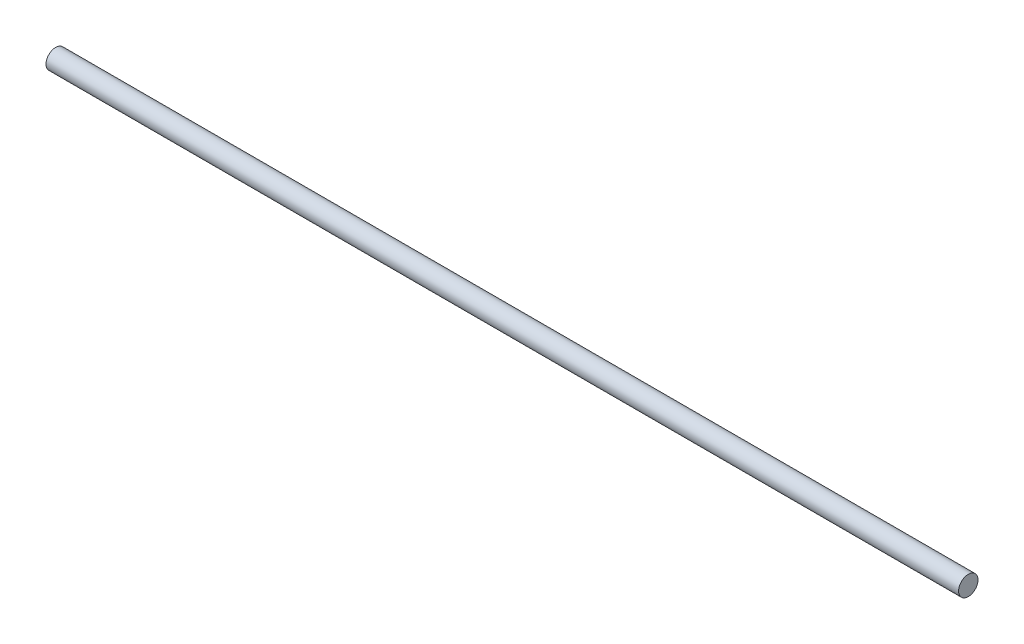
ISO-10303-21;
HEADER;
FILE_DESCRIPTION(('STEP AP214'),'2;1');
FILE_NAME('part.step','',(''),(''),'','','');
FILE_SCHEMA(('AUTOMOTIVE_DESIGN { 1 0 10303 214 1 1 1 1 }'));
ENDSEC;
DATA;
#1=APPLICATION_CONTEXT('core data for automotive mechanical design processes');
#2=APPLICATION_PROTOCOL_DEFINITION('international standard','automotive_design',2000,#1);
#3=PRODUCT_CONTEXT('',#1,'mechanical');
#4=PRODUCT('Part','Part','',(#3));
#5=PRODUCT_RELATED_PRODUCT_CATEGORY('part','',(#4));
#6=PRODUCT_DEFINITION_FORMATION('','',#4);
#7=PRODUCT_DEFINITION_CONTEXT('part definition',#1,'design');
#8=PRODUCT_DEFINITION('design','',#6,#7);
#9=PRODUCT_DEFINITION_SHAPE('','',#8);
#10=(LENGTH_UNIT() NAMED_UNIT(*) SI_UNIT(.MILLI.,.METRE.));
#11=(NAMED_UNIT(*) PLANE_ANGLE_UNIT() SI_UNIT($,.RADIAN.));
#12=(NAMED_UNIT(*) SI_UNIT($,.STERADIAN.) SOLID_ANGLE_UNIT());
#13=UNCERTAINTY_MEASURE_WITH_UNIT(LENGTH_MEASURE(1.E-05),#10,'distance_accuracy_value','');
#14=(GEOMETRIC_REPRESENTATION_CONTEXT(3) GLOBAL_UNCERTAINTY_ASSIGNED_CONTEXT((#13)) GLOBAL_UNIT_ASSIGNED_CONTEXT((#10,
#11,#12)) REPRESENTATION_CONTEXT('',''));
#15=CARTESIAN_POINT('',(0.,0.,0.));
#16=DIRECTION('',(0.,0.,1.));
#17=DIRECTION('',(1.,0.,0.));
#18=AXIS2_PLACEMENT_3D('',#15,#16,#17);
#19=CARTESIAN_POINT('',(1880.,-82.43469283425,1405.79287706017));
#20=DIRECTION('',(-1.,0.,0.));
#21=DIRECTION('',(0.,0.,1.));
#22=AXIS2_PLACEMENT_3D('',#19,#20,#21);
#23=CYLINDRICAL_SURFACE('',#22,20.);
#24=CARTESIAN_POINT('',(1880.,-82.43469283425,1405.79287706017));
#25=DIRECTION('',(1.,0.,0.));
#26=DIRECTION('',(0.,0.,-1.));
#27=AXIS2_PLACEMENT_3D('',#24,#25,#26);
#28=CIRCLE('',#27,20.);
#29=CARTESIAN_POINT('',(1880.,-82.43469283425,1425.79287706017));
#30=VERTEX_POINT('',#29);
#31=EDGE_CURVE('E10',#30,#30,#28,.T.);
#32=CARTESIAN_POINT('',(0.,-82.43469283425,1405.79287706017));
#33=DIRECTION('',(1.,0.,0.));
#34=DIRECTION('',(0.,0.,-1.));
#35=AXIS2_PLACEMENT_3D('',#32,#33,#34);
#36=CIRCLE('',#35,20.);
#37=CARTESIAN_POINT('',(-2.22044604925031E-13,-82.43469283425,1425.79287706017));
#38=VERTEX_POINT('',#37);
#39=EDGE_CURVE('E40',#38,#38,#36,.T.);
#40=CARTESIAN_POINT('',(1880.,-82.43469283425,1425.79287706017));
#41=CARTESIAN_POINT('',(1860.41666666667,-82.43469283425,1425.79287706017));
#42=CARTESIAN_POINT('',(1840.83333333333,-82.43469283425,1425.79287706017));
#43=CARTESIAN_POINT('',(1801.66666666667,-82.43469283425,1425.79287706017));
#44=CARTESIAN_POINT('',(1782.08333333333,-82.43469283425,1425.79287706017));
#45=CARTESIAN_POINT('',(1742.91666666667,-82.43469283425,1425.79287706017));
#46=CARTESIAN_POINT('',(1723.33333333333,-82.43469283425,1425.79287706017));
#47=CARTESIAN_POINT('',(1684.16666666667,-82.43469283425,1425.79287706017));
#48=CARTESIAN_POINT('',(1664.58333333333,-82.43469283425,1425.79287706017));
#49=CARTESIAN_POINT('',(1625.41666666667,-82.43469283425,1425.79287706017));
#50=CARTESIAN_POINT('',(1605.83333333333,-82.43469283425,1425.79287706017));
#51=CARTESIAN_POINT('',(1566.66666666667,-82.43469283425,1425.79287706017));
#52=CARTESIAN_POINT('',(1547.08333333333,-82.43469283425,1425.79287706017));
#53=CARTESIAN_POINT('',(1507.91666666667,-82.43469283425,1425.79287706017));
#54=CARTESIAN_POINT('',(1488.33333333333,-82.43469283425,1425.79287706017));
#55=CARTESIAN_POINT('',(1449.16666666667,-82.43469283425,1425.79287706017));
#56=CARTESIAN_POINT('',(1429.58333333333,-82.43469283425,1425.79287706017));
#57=CARTESIAN_POINT('',(1390.41666666667,-82.43469283425,1425.79287706017));
#58=CARTESIAN_POINT('',(1370.83333333333,-82.43469283425,1425.79287706017));
#59=CARTESIAN_POINT('',(1331.66666666667,-82.43469283425,1425.79287706017));
#60=CARTESIAN_POINT('',(1312.08333333333,-82.43469283425,1425.79287706017));
#61=CARTESIAN_POINT('',(1272.91666666667,-82.43469283425,1425.79287706017));
#62=CARTESIAN_POINT('',(1253.33333333333,-82.43469283425,1425.79287706017));
#63=CARTESIAN_POINT('',(1214.16666666667,-82.43469283425,1425.79287706017));
#64=CARTESIAN_POINT('',(1194.58333333333,-82.43469283425,1425.79287706017));
#65=CARTESIAN_POINT('',(1155.41666666667,-82.43469283425,1425.79287706017));
#66=CARTESIAN_POINT('',(1135.83333333333,-82.43469283425,1425.79287706017));
#67=CARTESIAN_POINT('',(1096.66666666667,-82.43469283425,1425.79287706017));
#68=CARTESIAN_POINT('',(1077.08333333333,-82.43469283425,1425.79287706017));
#69=CARTESIAN_POINT('',(1037.91666666667,-82.43469283425,1425.79287706017));
#70=CARTESIAN_POINT('',(1018.33333333333,-82.43469283425,1425.79287706017));
#71=CARTESIAN_POINT('',(979.166666666666,-82.43469283425,1425.79287706017));
#72=CARTESIAN_POINT('',(959.583333333333,-82.43469283425,1425.79287706017));
#73=CARTESIAN_POINT('',(920.416666666666,-82.43469283425,1425.79287706017));
#74=CARTESIAN_POINT('',(900.833333333333,-82.43469283425,1425.79287706017));
#75=CARTESIAN_POINT('',(861.666666666667,-82.43469283425,1425.79287706017));
#76=CARTESIAN_POINT('',(842.083333333333,-82.43469283425,1425.79287706017));
#77=CARTESIAN_POINT('',(802.916666666667,-82.43469283425,1425.79287706017));
#78=CARTESIAN_POINT('',(783.333333333333,-82.43469283425,1425.79287706017));
#79=CARTESIAN_POINT('',(744.166666666667,-82.43469283425,1425.79287706017));
#80=CARTESIAN_POINT('',(724.583333333333,-82.43469283425,1425.79287706017));
#81=CARTESIAN_POINT('',(685.416666666667,-82.43469283425,1425.79287706017));
#82=CARTESIAN_POINT('',(665.833333333333,-82.43469283425,1425.79287706017));
#83=CARTESIAN_POINT('',(626.666666666667,-82.43469283425,1425.79287706017));
#84=CARTESIAN_POINT('',(607.083333333333,-82.43469283425,1425.79287706017));
#85=CARTESIAN_POINT('',(567.916666666667,-82.43469283425,1425.79287706017));
#86=CARTESIAN_POINT('',(548.333333333333,-82.43469283425,1425.79287706017));
#87=CARTESIAN_POINT('',(509.166666666667,-82.43469283425,1425.79287706017));
#88=CARTESIAN_POINT('',(489.583333333333,-82.43469283425,1425.79287706017));
#89=CARTESIAN_POINT('',(450.416666666667,-82.43469283425,1425.79287706017));
#90=CARTESIAN_POINT('',(430.833333333333,-82.43469283425,1425.79287706017));
#91=CARTESIAN_POINT('',(391.666666666667,-82.43469283425,1425.79287706017));
#92=CARTESIAN_POINT('',(372.083333333333,-82.43469283425,1425.79287706017));
#93=CARTESIAN_POINT('',(332.916666666666,-82.43469283425,1425.79287706017));
#94=CARTESIAN_POINT('',(313.333333333333,-82.43469283425,1425.79287706017));
#95=CARTESIAN_POINT('',(274.166666666666,-82.43469283425,1425.79287706017));
#96=CARTESIAN_POINT('',(254.583333333333,-82.43469283425,1425.79287706017));
#97=CARTESIAN_POINT('',(215.416666666667,-82.43469283425,1425.79287706017));
#98=CARTESIAN_POINT('',(195.833333333333,-82.43469283425,1425.79287706017));
#99=CARTESIAN_POINT('',(156.666666666666,-82.43469283425,1425.79287706017));
#100=CARTESIAN_POINT('',(137.083333333333,-82.43469283425,1425.79287706017));
#101=CARTESIAN_POINT('',(97.9166666666664,-82.43469283425,1425.79287706017));
#102=CARTESIAN_POINT('',(78.3333333333331,-82.43469283425,1425.79287706017));
#103=CARTESIAN_POINT('',(39.1666666666665,-82.43469283425,1425.79287706017));
#104=CARTESIAN_POINT('',(19.5833333333331,-82.43469283425,1425.79287706017));
#105=CARTESIAN_POINT('',(-2.22044604925031E-13,-82.43469283425,1425.79287706017));
#106=B_SPLINE_CURVE_WITH_KNOTS('',3,(#40,#41,#42,#43,#44,#45,#46,#47,#48,#49,#50,#51,#52,#53,
#54,#55,#56,#57,#58,#59,#60,#61,#62,#63,#64,#65,#66,#67,#68,#69,#70,#71,#72,#73,#74,#75,#76,#77,
#78,#79,#80,#81,#82,#83,#84,#85,#86,#87,#88,#89,#90,#91,#92,#93,#94,#95,#96,#97,#98,#99,#100,
#101,#102,#103,#104,#105),.UNSPECIFIED.,.F.,.F.,(4,2,2,2,2,2,2,2,2,2,2,2,2,2,2,2,2,2,2,2,2,2,2,
2,2,2,2,2,2,2,2,2,4),(0.,58.7500000000001,117.5,176.25,235.,293.75,352.5,411.25,470.,528.75,
587.5,646.25,705.,763.75,822.5,881.25,940.,998.75,1057.5,1116.25,1175.,1233.75,1292.5,1351.25,
1410.,1468.75,1527.5,1586.25,1645.,1703.75,1762.5,1821.25,1880.),.UNSPECIFIED.);
#107=EDGE_CURVE('BSEAM37',#30,#38,#106,.T.);
#108=ORIENTED_EDGE('',*,*,#31,.F.);
#109=ORIENTED_EDGE('',*,*,#39,.T.);
#110=ORIENTED_EDGE('',*,*,#107,.T.);
#111=ORIENTED_EDGE('',*,*,#107,.F.);
#112=EDGE_LOOP('',(#108,#110,#109,#111));
#113=FACE_BOUND('',#112,.T.);
#114=ADVANCED_FACE('F37',(#113),#23,.T.);
#115=CARTESIAN_POINT('',(1880.,-82.43469283425,1405.79287706017));
#116=DIRECTION('',(1.,0.,0.));
#117=DIRECTION('',(0.,0.,-1.));
#118=AXIS2_PLACEMENT_3D('',#115,#116,#117);
#119=PLANE('',#118);
#120=ORIENTED_EDGE('',*,*,#31,.T.);
#121=EDGE_LOOP('',(#120));
#122=FACE_BOUND('',#121,.T.);
#123=ADVANCED_FACE('F52',(#122),#119,.T.);
#124=CARTESIAN_POINT('',(0.,-82.43469283425,1405.79287706017));
#125=DIRECTION('',(1.,0.,0.));
#126=DIRECTION('',(0.,0.,-1.));
#127=AXIS2_PLACEMENT_3D('',#124,#125,#126);
#128=PLANE('',#127);
#129=ORIENTED_EDGE('',*,*,#39,.F.);
#130=EDGE_LOOP('',(#129));
#131=FACE_BOUND('',#130,.T.);
#132=ADVANCED_FACE('F50',(#131),#128,.F.);
#133=CLOSED_SHELL('',(#114,#123,#132));
#134=MANIFOLD_SOLID_BREP('B2',#133);
#135=ADVANCED_BREP_SHAPE_REPRESENTATION('',(#18,#134),#14);
#136=SHAPE_DEFINITION_REPRESENTATION(#9,#135);
ENDSEC;
END-ISO-10303-21;
